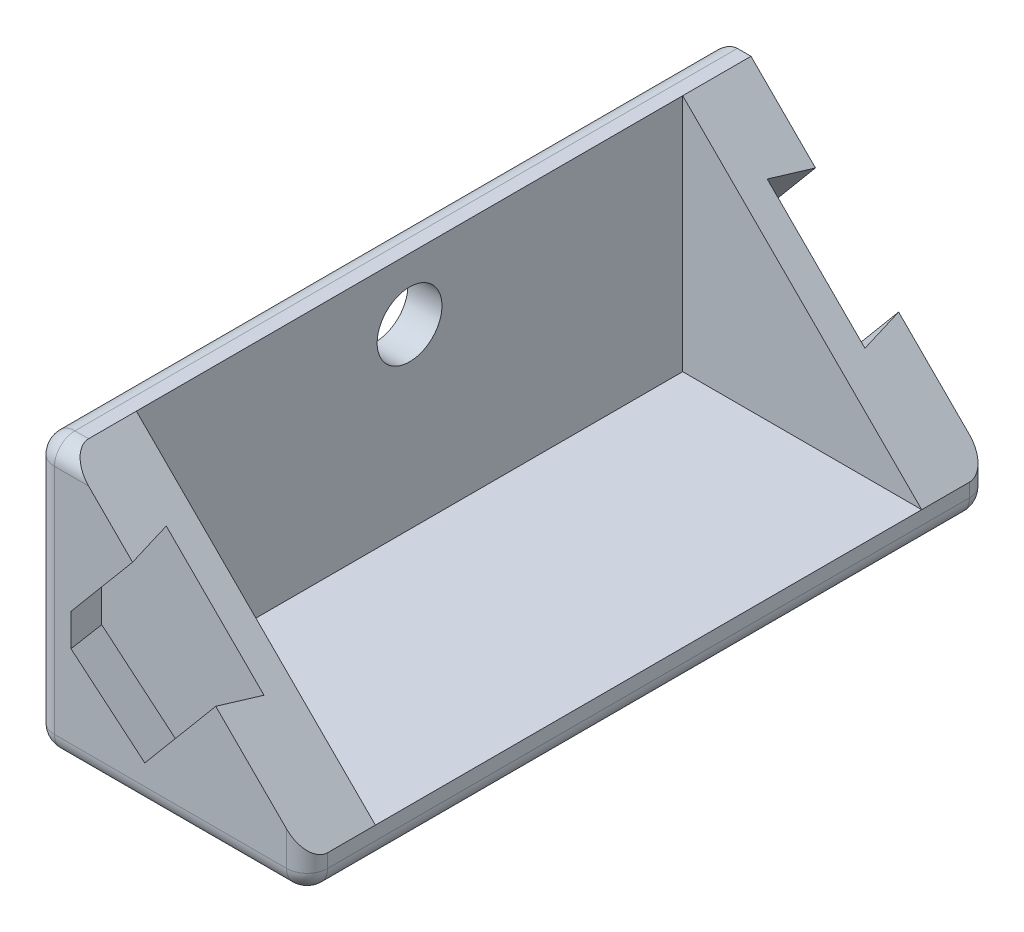
ISO-10303-21;
HEADER;
FILE_DESCRIPTION(('STEP AP214'),'2;1');
FILE_NAME('part.step','',(''),(''),'','','');
FILE_SCHEMA(('AUTOMOTIVE_DESIGN { 1 0 10303 214 1 1 1 1 }'));
ENDSEC;
DATA;
#1=APPLICATION_CONTEXT('core data for automotive mechanical design processes');
#2=APPLICATION_PROTOCOL_DEFINITION('international standard','automotive_design',2000,#1);
#3=PRODUCT_CONTEXT('',#1,'mechanical');
#4=PRODUCT('Part','Part','',(#3));
#5=PRODUCT_RELATED_PRODUCT_CATEGORY('part','',(#4));
#6=PRODUCT_DEFINITION_FORMATION('','',#4);
#7=PRODUCT_DEFINITION_CONTEXT('part definition',#1,'design');
#8=PRODUCT_DEFINITION('design','',#6,#7);
#9=PRODUCT_DEFINITION_SHAPE('','',#8);
#10=(LENGTH_UNIT() NAMED_UNIT(*) SI_UNIT(.MILLI.,.METRE.));
#11=(NAMED_UNIT(*) PLANE_ANGLE_UNIT() SI_UNIT($,.RADIAN.));
#12=(NAMED_UNIT(*) SI_UNIT($,.STERADIAN.) SOLID_ANGLE_UNIT());
#13=UNCERTAINTY_MEASURE_WITH_UNIT(LENGTH_MEASURE(1.E-05),#10,'distance_accuracy_value','');
#14=(GEOMETRIC_REPRESENTATION_CONTEXT(3) GLOBAL_UNCERTAINTY_ASSIGNED_CONTEXT((#13)) GLOBAL_UNIT_ASSIGNED_CONTEXT((#10,
#11,#12)) REPRESENTATION_CONTEXT('',''));
#15=CARTESIAN_POINT('',(0.,0.,0.));
#16=DIRECTION('',(0.,0.,1.));
#17=DIRECTION('',(1.,0.,0.));
#18=AXIS2_PLACEMENT_3D('',#15,#16,#17);
#19=CARTESIAN_POINT('',(0.,0.,-10.));
#20=DIRECTION('',(0.,0.,1.));
#21=DIRECTION('',(1.,0.,0.));
#22=AXIS2_PLACEMENT_3D('',#19,#20,#21);
#23=PLANE('',#22);
#24=DIRECTION('',(0.,-1.,0.));
#25=VECTOR('',#24,1.);
#26=CARTESIAN_POINT('',(-95.,0.,-10.));
#27=LINE('',#26,#25);
#28=CARTESIAN_POINT('',(-95.,-79.1753592594197,-10.));
#29=VERTEX_POINT('',#28);
#30=CARTESIAN_POINT('',(-95.,-114.17535925942,-10.));
#31=VERTEX_POINT('',#30);
#32=EDGE_CURVE('E372',#29,#31,#27,.T.);
#33=ORIENTED_EDGE('',*,*,#32,.F.);
#34=DIRECTION('',(0.707106781186546,-0.707106781186549,0.));
#35=VECTOR('',#34,1.);
#36=CARTESIAN_POINT('',(-87.08767962971,-87.0876796297097,-10.));
#37=LINE('',#36,#35);
#38=CARTESIAN_POINT('',(-60.0000000000002,-114.17535925942,-10.));
#39=VERTEX_POINT('',#38);
#40=EDGE_CURVE('E560',#29,#39,#37,.T.);
#41=ORIENTED_EDGE('',*,*,#40,.T.);
#42=DIRECTION('',(1.,0.,0.));
#43=VECTOR('',#42,1.);
#44=CARTESIAN_POINT('',(0.,-114.17535925942,-10.));
#45=LINE('',#44,#43);
#46=EDGE_CURVE('E232',#31,#39,#45,.T.);
#47=ORIENTED_EDGE('',*,*,#46,.F.);
#48=EDGE_LOOP('',(#33,#41,#47));
#49=FACE_BOUND('',#48,.T.);
#50=ADVANCED_FACE('F55',(#49),#23,.F.);
#51=CARTESIAN_POINT('',(-60.0000000000002,0.,-10.));
#52=DIRECTION('',(-1.,0.,0.));
#53=DIRECTION('',(0.,0.,1.));
#54=AXIS2_PLACEMENT_3D('',#51,#52,#53);
#55=PLANE('',#54);
#56=DIRECTION('',(0.,-1.,0.));
#57=VECTOR('',#56,1.);
#58=CARTESIAN_POINT('',(-60.0000000000002,-119.17535925942,-3.));
#59=LINE('',#58,#57);
#60=CARTESIAN_POINT('',(-60.0000000000002,-114.17535925942,-3.));
#61=VERTEX_POINT('',#60);
#62=CARTESIAN_POINT('',(-60.0000000000002,-116.17535925942,-3.));
#63=VERTEX_POINT('',#62);
#64=EDGE_CURVE('E702',#61,#63,#59,.T.);
#65=ORIENTED_EDGE('',*,*,#64,.T.);
#66=DIRECTION('',(0.,0.,1.));
#67=VECTOR('',#66,1.);
#68=CARTESIAN_POINT('',(-60.0000000000002,-116.17535925942,-97.));
#69=LINE('',#68,#67);
#70=CARTESIAN_POINT('',(-60.0000000000002,-116.17535925942,-97.));
#71=VERTEX_POINT('',#70);
#72=EDGE_CURVE('E654',#63,#71,#69,.F.);
#73=ORIENTED_EDGE('',*,*,#72,.T.);
#74=DIRECTION('',(0.,-1.,0.));
#75=VECTOR('',#74,1.);
#76=CARTESIAN_POINT('',(-60.0000000000002,-114.17535925942,-97.));
#77=LINE('',#76,#75);
#78=CARTESIAN_POINT('',(-60.0000000000002,-114.17535925942,-97.));
#79=VERTEX_POINT('',#78);
#80=EDGE_CURVE('E244',#71,#79,#77,.F.);
#81=ORIENTED_EDGE('',*,*,#80,.T.);
#82=DIRECTION('',(0.,0.,-1.));
#83=VECTOR('',#82,1.);
#84=CARTESIAN_POINT('',(-60.0000000000002,-114.17535925942,-90.));
#85=LINE('',#84,#83);
#86=CARTESIAN_POINT('',(-60.0000000000002,-114.17535925942,-90.));
#87=VERTEX_POINT('',#86);
#88=EDGE_CURVE('E240',#87,#79,#85,.T.);
#89=ORIENTED_EDGE('',*,*,#88,.F.);
#90=DIRECTION('',(0.,0.,1.));
#91=VECTOR('',#90,1.);
#92=CARTESIAN_POINT('',(-60.0000000000002,-114.17535925942,-50.));
#93=LINE('',#92,#91);
#94=EDGE_CURVE('E225',#87,#39,#93,.T.);
#95=ORIENTED_EDGE('',*,*,#94,.T.);
#96=DIRECTION('',(0.,0.,1.));
#97=VECTOR('',#96,1.);
#98=CARTESIAN_POINT('',(-60.0000000000002,-114.17535925942,-10.));
#99=LINE('',#98,#97);
#100=EDGE_CURVE('E564',#39,#61,#99,.T.);
#101=ORIENTED_EDGE('',*,*,#100,.T.);
#102=EDGE_LOOP('',(#65,#73,#81,#89,#95,#101));
#103=FACE_BOUND('',#102,.T.);
#104=ADVANCED_FACE('F242',(#103),#55,.F.);
#105=CARTESIAN_POINT('',(0.,-119.17535925942,-10.));
#106=DIRECTION('',(0.,-1.,0.));
#107=DIRECTION('',(0.,0.,-1.));
#108=AXIS2_PLACEMENT_3D('',#105,#106,#107);
#109=PLANE('',#108);
#110=DIRECTION('',(1.,0.,0.));
#111=VECTOR('',#110,1.);
#112=CARTESIAN_POINT('',(0.,-119.17535925942,-3.));
#113=LINE('',#112,#111);
#114=CARTESIAN_POINT('',(-63.0000000000002,-119.17535925942,-3.));
#115=VERTEX_POINT('',#114);
#116=CARTESIAN_POINT('',(-97.,-119.17535925942,-3.));
#117=VERTEX_POINT('',#116);
#118=EDGE_CURVE('E632',#115,#117,#113,.F.);
#119=ORIENTED_EDGE('',*,*,#118,.T.);
#120=DIRECTION('',(0.,0.,1.));
#121=VECTOR('',#120,1.);
#122=CARTESIAN_POINT('',(-97.,-119.17535925942,-97.));
#123=LINE('',#122,#121);
#124=CARTESIAN_POINT('',(-97.,-119.17535925942,-97.));
#125=VERTEX_POINT('',#124);
#126=EDGE_CURVE('E641',#117,#125,#123,.F.);
#127=ORIENTED_EDGE('',*,*,#126,.T.);
#128=DIRECTION('',(1.,0.,0.));
#129=VECTOR('',#128,1.);
#130=CARTESIAN_POINT('',(0.,-119.17535925942,-97.));
#131=LINE('',#130,#129);
#132=CARTESIAN_POINT('',(-63.0000000000002,-119.17535925942,-97.));
#133=VERTEX_POINT('',#132);
#134=EDGE_CURVE('E638',#125,#133,#131,.T.);
#135=ORIENTED_EDGE('',*,*,#134,.T.);
#136=DIRECTION('',(0.,0.,1.));
#137=VECTOR('',#136,1.);
#138=CARTESIAN_POINT('',(-63.0000000000002,-119.17535925942,-3.));
#139=LINE('',#138,#137);
#140=EDGE_CURVE('E635',#133,#115,#139,.T.);
#141=ORIENTED_EDGE('',*,*,#140,.T.);
#142=EDGE_LOOP('',(#119,#127,#135,#141));
#143=FACE_BOUND('',#142,.T.);
#144=ADVANCED_FACE('F842',(#143),#109,.T.);
#145=CARTESIAN_POINT('',(-100.,0.,-10.));
#146=DIRECTION('',(1.,0.,0.));
#147=DIRECTION('',(0.,0.,-1.));
#148=AXIS2_PLACEMENT_3D('',#145,#146,#147);
#149=PLANE('',#148);
#150=CARTESIAN_POINT('',(-100.,-88.1753592594197,-50.));
#151=DIRECTION('',(-1.,0.,0.));
#152=DIRECTION('',(0.,0.,1.));
#153=AXIS2_PLACEMENT_3D('',#150,#151,#152);
#154=CIRCLE('',#153,4.75);
#155=CARTESIAN_POINT('',(-100.,-88.1753592594197,-45.25));
#156=VERTEX_POINT('',#155);
#157=EDGE_CURVE('E1242',#156,#156,#154,.T.);
#158=ORIENTED_EDGE('',*,*,#157,.F.);
#159=EDGE_LOOP('',(#158));
#160=FACE_BOUND('',#159,.T.);
#161=DIRECTION('',(0.,1.,0.));
#162=VECTOR('',#161,1.);
#163=CARTESIAN_POINT('',(-100.,-119.17535925942,-97.));
#164=LINE('',#163,#162);
#165=CARTESIAN_POINT('',(-100.,-82.1753592594197,-97.));
#166=VERTEX_POINT('',#165);
#167=CARTESIAN_POINT('',(-100.,-116.17535925942,-97.));
#168=VERTEX_POINT('',#167);
#169=EDGE_CURVE('E599',#166,#168,#164,.F.);
#170=ORIENTED_EDGE('',*,*,#169,.T.);
#171=DIRECTION('',(0.,0.,1.));
#172=VECTOR('',#171,1.);
#173=CARTESIAN_POINT('',(-100.,-116.17535925942,-3.));
#174=LINE('',#173,#172);
#175=CARTESIAN_POINT('',(-100.,-116.17535925942,-3.));
#176=VERTEX_POINT('',#175);
#177=EDGE_CURVE('E629',#168,#176,#174,.T.);
#178=ORIENTED_EDGE('',*,*,#177,.T.);
#179=DIRECTION('',(0.,1.,0.));
#180=VECTOR('',#179,1.);
#181=CARTESIAN_POINT('',(-100.,-79.1753592594197,-3.));
#182=LINE('',#181,#180);
#183=CARTESIAN_POINT('',(-100.,-82.1753592594197,-3.));
#184=VERTEX_POINT('',#183);
#185=EDGE_CURVE('E596',#176,#184,#182,.T.);
#186=ORIENTED_EDGE('',*,*,#185,.T.);
#187=DIRECTION('',(0.,0.,1.));
#188=VECTOR('',#187,1.);
#189=CARTESIAN_POINT('',(-100.,-82.1753592594197,-10.));
#190=LINE('',#189,#188);
#191=EDGE_CURVE('E593',#184,#166,#190,.F.);
#192=ORIENTED_EDGE('',*,*,#191,.T.);
#193=EDGE_LOOP('',(#170,#178,#186,#192));
#194=FACE_BOUND('',#193,.T.);
#195=ADVANCED_FACE('F872',(#160,#194),#149,.F.);
#196=CARTESIAN_POINT('',(0.,-79.1753592594197,-10.));
#197=DIRECTION('',(0.,-1.,0.));
#198=DIRECTION('',(0.,0.,-1.));
#199=AXIS2_PLACEMENT_3D('',#196,#197,#198);
#200=PLANE('',#199);
#201=DIRECTION('',(1.,0.,0.));
#202=VECTOR('',#201,1.);
#203=CARTESIAN_POINT('',(0.,-79.1753592594197,-100.));
#204=LINE('',#203,#202);
#205=CARTESIAN_POINT('',(-97.,-79.1753592594197,-100.));
#206=VERTEX_POINT('',#205);
#207=CARTESIAN_POINT('',(-95.,-79.1753592594197,-100.));
#208=VERTEX_POINT('',#207);
#209=EDGE_CURVE('E259',#206,#208,#204,.T.);
#210=ORIENTED_EDGE('',*,*,#209,.F.);
#211=DIRECTION('',(0.,0.,1.));
#212=VECTOR('',#211,1.);
#213=CARTESIAN_POINT('',(-97.,-79.1753592594197,-10.));
#214=LINE('',#213,#212);
#215=CARTESIAN_POINT('',(-97.,-79.1753592594197,-3.));
#216=VERTEX_POINT('',#215);
#217=EDGE_CURVE('E606',#206,#216,#214,.T.);
#218=ORIENTED_EDGE('',*,*,#217,.T.);
#219=DIRECTION('',(1.,0.,0.));
#220=VECTOR('',#219,1.);
#221=CARTESIAN_POINT('',(-95.,-79.1753592594197,-3.));
#222=LINE('',#221,#220);
#223=CARTESIAN_POINT('',(-95.,-79.1753592594197,-3.));
#224=VERTEX_POINT('',#223);
#225=EDGE_CURVE('E603',#216,#224,#222,.T.);
#226=ORIENTED_EDGE('',*,*,#225,.T.);
#227=DIRECTION('',(0.,0.,1.));
#228=VECTOR('',#227,1.);
#229=CARTESIAN_POINT('',(-95.,-79.1753592594197,-10.));
#230=LINE('',#229,#228);
#231=EDGE_CURVE('E570',#29,#224,#230,.T.);
#232=ORIENTED_EDGE('',*,*,#231,.F.);
#233=DIRECTION('',(0.,0.,1.));
#234=VECTOR('',#233,1.);
#235=CARTESIAN_POINT('',(-95.,-79.1753592594197,-50.));
#236=LINE('',#235,#234);
#237=CARTESIAN_POINT('',(-95.,-79.1753592594197,-90.));
#238=VERTEX_POINT('',#237);
#239=EDGE_CURVE('E237',#238,#29,#236,.T.);
#240=ORIENTED_EDGE('',*,*,#239,.F.);
#241=DIRECTION('',(0.,0.,-1.));
#242=VECTOR('',#241,1.);
#243=CARTESIAN_POINT('',(-95.,-79.1753592594197,-90.));
#244=LINE('',#243,#242);
#245=EDGE_CURVE('E248',#238,#208,#244,.T.);
#246=ORIENTED_EDGE('',*,*,#245,.T.);
#247=EDGE_LOOP('',(#210,#218,#226,#232,#240,#246));
#248=FACE_BOUND('',#247,.T.);
#249=ADVANCED_FACE('F721',(#248),#200,.F.);
#250=CARTESIAN_POINT('',(-87.08767962971,-87.0876796297097,-10.));
#251=DIRECTION('',(-0.707106781186549,-0.707106781186546,0.));
#252=DIRECTION('',(0.707106781186546,-0.707106781186549,0.));
#253=AXIS2_PLACEMENT_3D('',#250,#251,#252);
#254=PLANE('',#253);
#255=DIRECTION('',(0.707106781186546,-0.707106781186549,0.));
#256=VECTOR('',#255,1.);
#257=CARTESIAN_POINT('',(-87.08767962971,-87.0876796297097,0.));
#258=LINE('',#257,#256);
#259=CARTESIAN_POINT('',(-73.3783438833581,-100.797015376062,0.));
#260=VERTEX_POINT('',#259);
#261=CARTESIAN_POINT('',(-63.0000000000002,-111.17535925942,0.));
#262=VERTEX_POINT('',#261);
#263=EDGE_CURVE('E557',#260,#262,#258,.T.);
#264=ORIENTED_EDGE('',*,*,#263,.T.);
#265=CARTESIAN_POINT('',(-63.0000000000002,-111.17535925942,-3.));
#266=DIRECTION('',(-0.707106781186549,-0.707106781186546,0.));
#267=DIRECTION('',(-0.707106781186546,0.707106781186549,0.));
#268=AXIS2_PLACEMENT_3D('',#265,#266,#267);
#269=ELLIPSE('',#268,4.24264068711929,3.);
#270=EDGE_CURVE('E590',#262,#61,#269,.F.);
#271=ORIENTED_EDGE('',*,*,#270,.T.);
#272=ORIENTED_EDGE('',*,*,#100,.F.);
#273=ORIENTED_EDGE('',*,*,#40,.F.);
#274=ORIENTED_EDGE('',*,*,#231,.T.);
#275=CARTESIAN_POINT('',(-92.,-82.1753592594197,-3.));
#276=DIRECTION('',(-0.707106781186549,-0.707106781186546,0.));
#277=DIRECTION('',(-0.707106781186546,0.707106781186549,0.));
#278=AXIS2_PLACEMENT_3D('',#275,#276,#277);
#279=ELLIPSE('',#278,4.24264068711928,3.);
#280=CARTESIAN_POINT('',(-92.,-82.1753592594197,0.));
#281=VERTEX_POINT('',#280);
#282=EDGE_CURVE('E587',#224,#281,#279,.F.);
#283=ORIENTED_EDGE('',*,*,#282,.T.);
#284=CARTESIAN_POINT('',(-85.5586459753106,-88.6167132841092,0.));
#285=VERTEX_POINT('',#284);
#286=EDGE_CURVE('E565',#281,#285,#258,.T.);
#287=ORIENTED_EDGE('',*,*,#286,.T.);
#288=DIRECTION('',(-0.172114938779374,0.172114938779375,-0.969924170076169));
#289=VECTOR('',#288,1.);
#290=CARTESIAN_POINT('',(-87.3186211832471,-86.8567380761727,-9.91803794033605));
#291=LINE('',#290,#289);
#292=CARTESIAN_POINT('',(-86.6233576966354,-87.5520015627843,-6.));
#293=VERTEX_POINT('',#292);
#294=EDGE_CURVE('E551',#285,#293,#291,.T.);
#295=ORIENTED_EDGE('',*,*,#294,.T.);
#296=DIRECTION('',(-0.707106781186546,0.707106781186549,0.));
#297=VECTOR('',#296,1.);
#298=CARTESIAN_POINT('',(-87.08767962971,-87.0876796297097,-6.));
#299=LINE('',#298,#297);
#300=CARTESIAN_POINT('',(-72.3136321620333,-101.861727097386,-6.));
#301=VERTEX_POINT('',#300);
#302=EDGE_CURVE('E708',#301,#293,#299,.T.);
#303=ORIENTED_EDGE('',*,*,#302,.F.);
#304=DIRECTION('',(-0.172114938779375,0.172114938779376,0.969924170076168));
#305=VECTOR('',#304,1.);
#306=CARTESIAN_POINT('',(-72.5211979367011,-101.654161322719,-4.83029873433046));
#307=LINE('',#306,#305);
#308=EDGE_CURVE('E547',#301,#260,#307,.T.);
#309=ORIENTED_EDGE('',*,*,#308,.T.);
#310=EDGE_LOOP('',(#264,#271,#272,#273,#274,#283,#287,#295,#303,#309));
#311=FACE_BOUND('',#310,.T.);
#312=ADVANCED_FACE('F728',(#311),#254,.F.);
#313=CARTESIAN_POINT('',(0.,0.,0.));
#314=DIRECTION('',(0.,0.,1.));
#315=DIRECTION('',(1.,0.,0.));
#316=AXIS2_PLACEMENT_3D('',#313,#314,#315);
#317=PLANE('',#316);
#318=DIRECTION('',(0.,1.,0.));
#319=VECTOR('',#318,1.);
#320=CARTESIAN_POINT('',(-97.,-119.17535925942,0.));
#321=LINE('',#320,#319);
#322=CARTESIAN_POINT('',(-97.,-82.1753592594197,0.));
#323=VERTEX_POINT('',#322);
#324=CARTESIAN_POINT('',(-97.,-116.17535925942,0.));
#325=VERTEX_POINT('',#324);
#326=EDGE_CURVE('E581',#323,#325,#321,.F.);
#327=ORIENTED_EDGE('',*,*,#326,.T.);
#328=DIRECTION('',(1.,0.,0.));
#329=VECTOR('',#328,1.);
#330=CARTESIAN_POINT('',(0.,-116.17535925942,0.));
#331=LINE('',#330,#329);
#332=CARTESIAN_POINT('',(-63.0000000000002,-116.17535925942,0.));
#333=VERTEX_POINT('',#332);
#334=EDGE_CURVE('E12',#325,#333,#331,.T.);
#335=ORIENTED_EDGE('',*,*,#334,.T.);
#336=DIRECTION('',(0.,-1.,0.));
#337=VECTOR('',#336,1.);
#338=CARTESIAN_POINT('',(-63.0000000000002,-114.17535925942,0.));
#339=LINE('',#338,#337);
#340=EDGE_CURVE('E584',#333,#262,#339,.F.);
#341=ORIENTED_EDGE('',*,*,#340,.T.);
#342=ORIENTED_EDGE('',*,*,#263,.F.);
#343=DIRECTION('',(0.642787609686544,0.766044443118975,0.));
#344=VECTOR('',#343,1.);
#345=CARTESIAN_POINT('',(6.57266132195838,-5.51511769110851,0.));
#346=LINE('',#345,#344);
#347=CARTESIAN_POINT('',(-83.7645532854487,-113.174817744439,0.));
#348=VERTEX_POINT('',#347);
#349=EDGE_CURVE('E733',#348,#260,#346,.T.);
#350=ORIENTED_EDGE('',*,*,#349,.F.);
#351=DIRECTION('',(-0.766044443118975,0.642787609686543,0.));
#352=VECTOR('',#351,1.);
#353=CARTESIAN_POINT('',(-90.337214607407,-107.65970005333,0.));
#354=LINE('',#353,#352);
#355=CARTESIAN_POINT('',(-94.58,-104.099580395241,0.));
#356=VERTEX_POINT('',#355);
#357=EDGE_CURVE('E815',#348,#356,#354,.T.);
#358=ORIENTED_EDGE('',*,*,#357,.T.);
#359=DIRECTION('',(0.,1.,0.));
#360=VECTOR('',#359,1.);
#361=CARTESIAN_POINT('',(-94.5800000000003,-2.77401127046176E-13,0.));
#362=LINE('',#361,#360);
#363=CARTESIAN_POINT('',(-94.58,-99.3679443530969,0.));
#364=VERTEX_POINT('',#363);
#365=EDGE_CURVE('E525',#356,#364,#362,.T.);
#366=ORIENTED_EDGE('',*,*,#365,.T.);
#367=DIRECTION('',(0.642787609686544,0.766044443118974,0.));
#368=VECTOR('',#367,1.);
#369=CARTESIAN_POINT('',(-6.57266132196076,5.51511769111051,0.));
#370=LINE('',#369,#368);
#371=EDGE_CURVE('E552',#364,#285,#370,.T.);
#372=ORIENTED_EDGE('',*,*,#371,.T.);
#373=ORIENTED_EDGE('',*,*,#286,.F.);
#374=DIRECTION('',(1.,0.,0.));
#375=VECTOR('',#374,1.);
#376=CARTESIAN_POINT('',(-100.,-82.1753592594197,0.));
#377=LINE('',#376,#375);
#378=EDGE_CURVE('E578',#281,#323,#377,.F.);
#379=ORIENTED_EDGE('',*,*,#378,.T.);
#380=EDGE_LOOP('',(#327,#335,#341,#342,#350,#358,#366,#372,#373,#379));
#381=FACE_BOUND('',#380,.T.);
#382=ADVANCED_FACE('F762',(#381),#317,.T.);
#383=CARTESIAN_POINT('',(0.,0.,-6.));
#384=DIRECTION('',(0.,0.,1.));
#385=DIRECTION('',(1.,0.,0.));
#386=AXIS2_PLACEMENT_3D('',#383,#384,#385);
#387=PLANE('',#386);
#388=ORIENTED_EDGE('',*,*,#302,.T.);
#389=DIRECTION('',(0.642787609686527,0.766044443118989,0.));
#390=VECTOR('',#389,1.);
#391=CARTESIAN_POINT('',(-7.72172798664173,6.47929910564214,-6.));
#392=LINE('',#391,#390);
#393=CARTESIAN_POINT('',(-96.08,-98.8219890016976,-6.));
#394=VERTEX_POINT('',#393);
#395=EDGE_CURVE('E479',#394,#293,#392,.T.);
#396=ORIENTED_EDGE('',*,*,#395,.F.);
#397=DIRECTION('',(0.,1.,0.));
#398=VECTOR('',#397,1.);
#399=CARTESIAN_POINT('',(-96.08,0.,-6.));
#400=LINE('',#399,#398);
#401=CARTESIAN_POINT('',(-96.08,-104.799041882474,-6.));
#402=VERTEX_POINT('',#401);
#403=EDGE_CURVE('E473',#402,#394,#400,.T.);
#404=ORIENTED_EDGE('',*,*,#403,.F.);
#405=DIRECTION('',(-0.766044443118869,0.642787609686669,0.));
#406=VECTOR('',#405,1.);
#407=CARTESIAN_POINT('',(-91.3013960219553,-108.808766717995,-6.));
#408=LINE('',#407,#406);
#409=CARTESIAN_POINT('',(-83.5796680353017,-115.288065823649,-6.));
#410=VERTEX_POINT('',#409);
#411=EDGE_CURVE('E742',#410,#402,#408,.T.);
#412=ORIENTED_EDGE('',*,*,#411,.F.);
#413=DIRECTION('',(-0.642787609686543,-0.766044443118975,0.));
#414=VECTOR('',#413,1.);
#415=CARTESIAN_POINT('',(7.72172798663679,-6.47929910563828,-6.));
#416=LINE('',#415,#414);
#417=EDGE_CURVE('E543',#301,#410,#416,.T.);
#418=ORIENTED_EDGE('',*,*,#417,.F.);
#419=EDGE_LOOP('',(#388,#396,#404,#412,#418));
#420=FACE_BOUND('',#419,.T.);
#421=ADVANCED_FACE('F498',(#420),#387,.T.);
#422=CARTESIAN_POINT('',(-6.18603418537483,5.19069900339812,2.01882352941175));
#423=DIRECTION('',(-0.74317227126988,0.623595578723745,0.242535625036333));
#424=DIRECTION('',(-0.642787609686544,-0.766044443118974,0.));
#425=AXIS2_PLACEMENT_3D('',#422,#423,#424);
#426=PLANE('',#425);
#427=ORIENTED_EDGE('',*,*,#371,.F.);
#428=DIRECTION('',(0.241596119887387,-0.0879337963532224,0.966384479549557));
#429=VECTOR('',#428,1.);
#430=CARTESIAN_POINT('',(-96.08,-98.8219890016976,-6.));
#431=LINE('',#430,#429);
#432=EDGE_CURVE('E485',#394,#364,#431,.T.);
#433=ORIENTED_EDGE('',*,*,#432,.F.);
#434=ORIENTED_EDGE('',*,*,#395,.T.);
#435=ORIENTED_EDGE('',*,*,#294,.F.);
#436=EDGE_LOOP('',(#427,#433,#434,#435));
#437=FACE_BOUND('',#436,.T.);
#438=ADVANCED_FACE('F487',(#437),#426,.F.);
#439=CARTESIAN_POINT('',(6.18603418537258,-5.19069900339624,2.01882352941103));
#440=DIRECTION('',(0.74317227126988,-0.623595578723745,0.242535625036334));
#441=DIRECTION('',(0.642787609686544,0.766044443118975,0.));
#442=AXIS2_PLACEMENT_3D('',#439,#440,#441);
#443=PLANE('',#442);
#444=ORIENTED_EDGE('',*,*,#417,.T.);
#445=DIRECTION('',(-0.0290519142489422,0.332064899364209,0.942809041581968));
#446=VECTOR('',#445,1.);
#447=CARTESIAN_POINT('',(-83.5796680353017,-115.288065823649,-6.));
#448=LINE('',#447,#446);
#449=EDGE_CURVE('E516',#410,#348,#448,.T.);
#450=ORIENTED_EDGE('',*,*,#449,.T.);
#451=ORIENTED_EDGE('',*,*,#349,.T.);
#452=ORIENTED_EDGE('',*,*,#308,.F.);
#453=EDGE_LOOP('',(#444,#450,#451,#452));
#454=FACE_BOUND('',#453,.T.);
#455=ADVANCED_FACE('F497',(#454),#443,.F.);
#456=CARTESIAN_POINT('',(-89.0164705882355,-2.61083413690519E-13,22.2541176470589));
#457=DIRECTION('',(-0.970142500145332,0.,0.242535625036333));
#458=DIRECTION('',(0.242535625036333,0.,0.970142500145332));
#459=AXIS2_PLACEMENT_3D('',#456,#457,#458);
#460=PLANE('',#459);
#461=DIRECTION('',(0.240999241199596,0.11237979178092,0.963996964798384));
#462=VECTOR('',#461,1.);
#463=CARTESIAN_POINT('',(-96.08,-104.799041882474,-6.));
#464=LINE('',#463,#462);
#465=EDGE_CURVE('E795',#402,#356,#464,.T.);
#466=ORIENTED_EDGE('',*,*,#465,.F.);
#467=ORIENTED_EDGE('',*,*,#403,.T.);
#468=ORIENTED_EDGE('',*,*,#432,.T.);
#469=ORIENTED_EDGE('',*,*,#365,.F.);
#470=EDGE_LOOP('',(#466,#467,#468,#469));
#471=FACE_BOUND('',#470,.T.);
#472=ADVANCED_FACE('F499',(#471),#460,.F.);
#473=CARTESIAN_POINT('',(-85.0232608069532,-101.32677652076,33.0681781687456));
#474=DIRECTION('',(-0.623595578723678,-0.743172271269802,0.242535625036745));
#475=DIRECTION('',(0.766044443118975,-0.642787609686543,0.));
#476=AXIS2_PLACEMENT_3D('',#473,#474,#475);
#477=PLANE('',#476);
#478=ORIENTED_EDGE('',*,*,#449,.F.);
#479=ORIENTED_EDGE('',*,*,#411,.T.);
#480=ORIENTED_EDGE('',*,*,#465,.T.);
#481=ORIENTED_EDGE('',*,*,#357,.F.);
#482=EDGE_LOOP('',(#478,#479,#480,#481));
#483=FACE_BOUND('',#482,.T.);
#484=ADVANCED_FACE('F502',(#483),#477,.F.);
#485=CARTESIAN_POINT('',(-95.,0.,-50.));
#486=DIRECTION('',(-1.,0.,0.));
#487=DIRECTION('',(0.,0.,1.));
#488=AXIS2_PLACEMENT_3D('',#485,#486,#487);
#489=PLANE('',#488);
#490=CARTESIAN_POINT('',(-95.,-88.1753592594197,-50.));
#491=DIRECTION('',(-1.,0.,0.));
#492=DIRECTION('',(0.,0.,1.));
#493=AXIS2_PLACEMENT_3D('',#490,#491,#492);
#494=CIRCLE('',#493,4.75);
#495=CARTESIAN_POINT('',(-95.,-88.1753592594197,-45.25));
#496=VERTEX_POINT('',#495);
#497=EDGE_CURVE('E59',#496,#496,#494,.T.);
#498=ORIENTED_EDGE('',*,*,#497,.T.);
#499=EDGE_LOOP('',(#498));
#500=FACE_BOUND('',#499,.T.);
#501=ORIENTED_EDGE('',*,*,#32,.T.);
#502=DIRECTION('',(0.,0.,1.));
#503=VECTOR('',#502,1.);
#504=CARTESIAN_POINT('',(-95.,-114.17535925942,-50.));
#505=LINE('',#504,#503);
#506=CARTESIAN_POINT('',(-95.,-114.17535925942,-90.));
#507=VERTEX_POINT('',#506);
#508=EDGE_CURVE('E236',#507,#31,#505,.T.);
#509=ORIENTED_EDGE('',*,*,#508,.F.);
#510=DIRECTION('',(0.,-1.,0.));
#511=VECTOR('',#510,1.);
#512=CARTESIAN_POINT('',(-95.,0.,-90.));
#513=LINE('',#512,#511);
#514=EDGE_CURVE('E262',#238,#507,#513,.T.);
#515=ORIENTED_EDGE('',*,*,#514,.F.);
#516=ORIENTED_EDGE('',*,*,#239,.T.);
#517=EDGE_LOOP('',(#501,#509,#515,#516));
#518=FACE_BOUND('',#517,.T.);
#519=ADVANCED_FACE('F506',(#500,#518),#489,.F.);
#520=CARTESIAN_POINT('',(0.,-114.17535925942,-50.));
#521=DIRECTION('',(0.,-1.,0.));
#522=DIRECTION('',(0.,0.,-1.));
#523=AXIS2_PLACEMENT_3D('',#520,#521,#522);
#524=PLANE('',#523);
#525=ORIENTED_EDGE('',*,*,#46,.T.);
#526=ORIENTED_EDGE('',*,*,#94,.F.);
#527=DIRECTION('',(1.,0.,0.));
#528=VECTOR('',#527,1.);
#529=CARTESIAN_POINT('',(0.,-114.17535925942,-90.));
#530=LINE('',#529,#528);
#531=EDGE_CURVE('E230',#507,#87,#530,.T.);
#532=ORIENTED_EDGE('',*,*,#531,.F.);
#533=ORIENTED_EDGE('',*,*,#508,.T.);
#534=EDGE_LOOP('',(#525,#526,#532,#533));
#535=FACE_BOUND('',#534,.T.);
#536=ADVANCED_FACE('F227',(#535),#524,.F.);
#537=CARTESIAN_POINT('',(0.,0.,-90.));
#538=DIRECTION('',(0.,0.,-1.));
#539=DIRECTION('',(1.,0.,0.));
#540=AXIS2_PLACEMENT_3D('',#537,#538,#539);
#541=PLANE('',#540);
#542=ORIENTED_EDGE('',*,*,#514,.T.);
#543=ORIENTED_EDGE('',*,*,#531,.T.);
#544=DIRECTION('',(0.707106781186546,-0.707106781186549,0.));
#545=VECTOR('',#544,1.);
#546=CARTESIAN_POINT('',(-87.08767962971,-87.0876796297097,-90.));
#547=LINE('',#546,#545);
#548=EDGE_CURVE('E249',#238,#87,#547,.T.);
#549=ORIENTED_EDGE('',*,*,#548,.F.);
#550=EDGE_LOOP('',(#542,#543,#549));
#551=FACE_BOUND('',#550,.T.);
#552=ADVANCED_FACE('F261',(#551),#541,.F.);
#553=CARTESIAN_POINT('',(-87.08767962971,-87.0876796297097,-90.));
#554=DIRECTION('',(-0.707106781186549,-0.707106781186546,0.));
#555=DIRECTION('',(0.707106781186546,-0.707106781186549,0.));
#556=AXIS2_PLACEMENT_3D('',#553,#554,#555);
#557=PLANE('',#556);
#558=ORIENTED_EDGE('',*,*,#88,.T.);
#559=CARTESIAN_POINT('',(-63.0000000000002,-111.17535925942,-97.));
#560=DIRECTION('',(-0.707106781186549,-0.707106781186546,0.));
#561=DIRECTION('',(-0.707106781186546,0.707106781186549,0.));
#562=AXIS2_PLACEMENT_3D('',#559,#560,#561);
#563=ELLIPSE('',#562,4.24264068711929,3.);
#564=CARTESIAN_POINT('',(-63.0000000000002,-111.17535925942,-100.));
#565=VERTEX_POINT('',#564);
#566=EDGE_CURVE('E576',#79,#565,#563,.F.);
#567=ORIENTED_EDGE('',*,*,#566,.T.);
#568=DIRECTION('',(0.707106781186546,-0.707106781186549,0.));
#569=VECTOR('',#568,1.);
#570=CARTESIAN_POINT('',(-87.08767962971,-87.0876796297097,-100.));
#571=LINE('',#570,#569);
#572=CARTESIAN_POINT('',(-73.3783438833581,-100.797015376062,-100.));
#573=VERTEX_POINT('',#572);
#574=EDGE_CURVE('E355',#573,#565,#571,.T.);
#575=ORIENTED_EDGE('',*,*,#574,.F.);
#576=DIRECTION('',(-0.172114938779375,0.172114938779376,-0.969924170076168));
#577=VECTOR('',#576,1.);
#578=CARTESIAN_POINT('',(-72.5211979367011,-101.654161322719,-95.1697012656695));
#579=LINE('',#578,#577);
#580=CARTESIAN_POINT('',(-72.3136321620333,-101.861727097386,-94.));
#581=VERTEX_POINT('',#580);
#582=EDGE_CURVE('E346',#581,#573,#579,.T.);
#583=ORIENTED_EDGE('',*,*,#582,.F.);
#584=DIRECTION('',(-0.707106781186546,0.707106781186549,0.));
#585=VECTOR('',#584,1.);
#586=CARTESIAN_POINT('',(-87.08767962971,-87.0876796297097,-94.));
#587=LINE('',#586,#585);
#588=CARTESIAN_POINT('',(-86.6233576966354,-87.5520015627843,-94.));
#589=VERTEX_POINT('',#588);
#590=EDGE_CURVE('E368',#581,#589,#587,.T.);
#591=ORIENTED_EDGE('',*,*,#590,.T.);
#592=DIRECTION('',(-0.172114938779374,0.172114938779375,0.969924170076169));
#593=VECTOR('',#592,1.);
#594=CARTESIAN_POINT('',(-87.3186211832471,-86.8567380761727,-90.081962059664));
#595=LINE('',#594,#593);
#596=CARTESIAN_POINT('',(-85.5586459753106,-88.6167132841092,-100.));
#597=VERTEX_POINT('',#596);
#598=EDGE_CURVE('E349',#597,#589,#595,.T.);
#599=ORIENTED_EDGE('',*,*,#598,.F.);
#600=EDGE_CURVE('E362',#208,#597,#571,.T.);
#601=ORIENTED_EDGE('',*,*,#600,.F.);
#602=ORIENTED_EDGE('',*,*,#245,.F.);
#603=ORIENTED_EDGE('',*,*,#548,.T.);
#604=EDGE_LOOP('',(#558,#567,#575,#583,#591,#599,#601,#602,#603));
#605=FACE_BOUND('',#604,.T.);
#606=ADVANCED_FACE('F253',(#605),#557,.F.);
#607=CARTESIAN_POINT('',(0.,0.,-100.));
#608=DIRECTION('',(0.,0.,-1.));
#609=DIRECTION('',(1.,0.,0.));
#610=AXIS2_PLACEMENT_3D('',#607,#608,#609);
#611=PLANE('',#610);
#612=DIRECTION('',(0.,-1.,0.));
#613=VECTOR('',#612,1.);
#614=CARTESIAN_POINT('',(-63.0000000000002,-119.17535925942,-100.));
#615=LINE('',#614,#613);
#616=CARTESIAN_POINT('',(-63.0000000000002,-116.17535925942,-100.));
#617=VERTEX_POINT('',#616);
#618=EDGE_CURVE('E698',#565,#617,#615,.T.);
#619=ORIENTED_EDGE('',*,*,#618,.T.);
#620=DIRECTION('',(1.,0.,0.));
#621=VECTOR('',#620,1.);
#622=CARTESIAN_POINT('',(0.,-116.17535925942,-100.));
#623=LINE('',#622,#621);
#624=CARTESIAN_POINT('',(-97.,-116.17535925942,-100.));
#625=VERTEX_POINT('',#624);
#626=EDGE_CURVE('E648',#617,#625,#623,.F.);
#627=ORIENTED_EDGE('',*,*,#626,.T.);
#628=DIRECTION('',(0.,1.,0.));
#629=VECTOR('',#628,1.);
#630=CARTESIAN_POINT('',(-97.,-79.1753592594197,-100.));
#631=LINE('',#630,#629);
#632=EDGE_CURVE('E703',#625,#206,#631,.T.);
#633=ORIENTED_EDGE('',*,*,#632,.T.);
#634=ORIENTED_EDGE('',*,*,#209,.T.);
#635=ORIENTED_EDGE('',*,*,#600,.T.);
#636=DIRECTION('',(0.642787609686544,0.766044443118974,0.));
#637=VECTOR('',#636,1.);
#638=CARTESIAN_POINT('',(-6.57266132196076,5.51511769111051,-100.));
#639=LINE('',#638,#637);
#640=CARTESIAN_POINT('',(-94.58,-99.3679443530969,-100.));
#641=VERTEX_POINT('',#640);
#642=EDGE_CURVE('E350',#641,#597,#639,.T.);
#643=ORIENTED_EDGE('',*,*,#642,.F.);
#644=DIRECTION('',(0.,1.,0.));
#645=VECTOR('',#644,1.);
#646=CARTESIAN_POINT('',(-94.5800000000003,-2.77401127046176E-13,-100.));
#647=LINE('',#646,#645);
#648=CARTESIAN_POINT('',(-94.58,-104.099580395241,-100.));
#649=VERTEX_POINT('',#648);
#650=EDGE_CURVE('E324',#649,#641,#647,.T.);
#651=ORIENTED_EDGE('',*,*,#650,.F.);
#652=DIRECTION('',(-0.766044443118975,0.642787609686543,0.));
#653=VECTOR('',#652,1.);
#654=CARTESIAN_POINT('',(-90.337214607407,-107.65970005333,-100.));
#655=LINE('',#654,#653);
#656=CARTESIAN_POINT('',(-83.7645532854487,-113.174817744439,-100.));
#657=VERTEX_POINT('',#656);
#658=EDGE_CURVE('E449',#657,#649,#655,.T.);
#659=ORIENTED_EDGE('',*,*,#658,.F.);
#660=DIRECTION('',(0.642787609686544,0.766044443118975,0.));
#661=VECTOR('',#660,1.);
#662=CARTESIAN_POINT('',(6.57266132195838,-5.51511769110851,-100.));
#663=LINE('',#662,#661);
#664=EDGE_CURVE('E373',#657,#573,#663,.T.);
#665=ORIENTED_EDGE('',*,*,#664,.T.);
#666=ORIENTED_EDGE('',*,*,#574,.T.);
#667=EDGE_LOOP('',(#619,#627,#633,#634,#635,#643,#651,#659,#665,#666));
#668=FACE_BOUND('',#667,.T.);
#669=ADVANCED_FACE('F398',(#668),#611,.T.);
#670=CARTESIAN_POINT('',(0.,0.,-94.));
#671=DIRECTION('',(0.,0.,-1.));
#672=DIRECTION('',(1.,0.,0.));
#673=AXIS2_PLACEMENT_3D('',#670,#671,#672);
#674=PLANE('',#673);
#675=ORIENTED_EDGE('',*,*,#590,.F.);
#676=DIRECTION('',(-0.642787609686543,-0.766044443118975,0.));
#677=VECTOR('',#676,1.);
#678=CARTESIAN_POINT('',(7.72172798663679,-6.47929910563828,-94.));
#679=LINE('',#678,#677);
#680=CARTESIAN_POINT('',(-83.5796680353017,-115.288065823649,-94.));
#681=VERTEX_POINT('',#680);
#682=EDGE_CURVE('E342',#581,#681,#679,.T.);
#683=ORIENTED_EDGE('',*,*,#682,.T.);
#684=DIRECTION('',(-0.766044443118869,0.642787609686669,0.));
#685=VECTOR('',#684,1.);
#686=CARTESIAN_POINT('',(-91.3013960219553,-108.808766717995,-94.));
#687=LINE('',#686,#685);
#688=CARTESIAN_POINT('',(-96.08,-104.799041882474,-94.));
#689=VERTEX_POINT('',#688);
#690=EDGE_CURVE('E269',#681,#689,#687,.T.);
#691=ORIENTED_EDGE('',*,*,#690,.T.);
#692=DIRECTION('',(0.,1.,0.));
#693=VECTOR('',#692,1.);
#694=CARTESIAN_POINT('',(-96.08,0.,-94.));
#695=LINE('',#694,#693);
#696=CARTESIAN_POINT('',(-96.08,-98.8219890016976,-94.));
#697=VERTEX_POINT('',#696);
#698=EDGE_CURVE('E264',#689,#697,#695,.T.);
#699=ORIENTED_EDGE('',*,*,#698,.T.);
#700=DIRECTION('',(0.642787609686527,0.766044443118989,0.));
#701=VECTOR('',#700,1.);
#702=CARTESIAN_POINT('',(-7.72172798664173,6.47929910564214,-94.));
#703=LINE('',#702,#701);
#704=EDGE_CURVE('E279',#697,#589,#703,.T.);
#705=ORIENTED_EDGE('',*,*,#704,.T.);
#706=EDGE_LOOP('',(#675,#683,#691,#699,#705));
#707=FACE_BOUND('',#706,.T.);
#708=ADVANCED_FACE('F297',(#707),#674,.T.);
#709=CARTESIAN_POINT('',(-6.18603418537483,5.19069900339812,-102.018823529412));
#710=DIRECTION('',(-0.74317227126988,0.623595578723745,-0.242535625036333));
#711=DIRECTION('',(-0.642787609686544,-0.766044443118974,0.));
#712=AXIS2_PLACEMENT_3D('',#709,#710,#711);
#713=PLANE('',#712);
#714=ORIENTED_EDGE('',*,*,#642,.T.);
#715=ORIENTED_EDGE('',*,*,#598,.T.);
#716=ORIENTED_EDGE('',*,*,#704,.F.);
#717=DIRECTION('',(0.241596119887387,-0.0879337963532224,-0.966384479549557));
#718=VECTOR('',#717,1.);
#719=CARTESIAN_POINT('',(-96.08,-98.8219890016976,-94.));
#720=LINE('',#719,#718);
#721=EDGE_CURVE('E284',#697,#641,#720,.T.);
#722=ORIENTED_EDGE('',*,*,#721,.T.);
#723=EDGE_LOOP('',(#714,#715,#716,#722));
#724=FACE_BOUND('',#723,.T.);
#725=ADVANCED_FACE('F286',(#724),#713,.F.);
#726=CARTESIAN_POINT('',(6.18603418537258,-5.19069900339624,-102.018823529411));
#727=DIRECTION('',(0.74317227126988,-0.623595578723745,-0.242535625036334));
#728=DIRECTION('',(0.642787609686544,0.766044443118975,0.));
#729=AXIS2_PLACEMENT_3D('',#726,#727,#728);
#730=PLANE('',#729);
#731=ORIENTED_EDGE('',*,*,#682,.F.);
#732=ORIENTED_EDGE('',*,*,#582,.T.);
#733=ORIENTED_EDGE('',*,*,#664,.F.);
#734=DIRECTION('',(-0.0290519142489422,0.332064899364209,-0.942809041581968));
#735=VECTOR('',#734,1.);
#736=CARTESIAN_POINT('',(-83.5796680353017,-115.288065823649,-94.));
#737=LINE('',#736,#735);
#738=EDGE_CURVE('E316',#681,#657,#737,.T.);
#739=ORIENTED_EDGE('',*,*,#738,.F.);
#740=EDGE_LOOP('',(#731,#732,#733,#739));
#741=FACE_BOUND('',#740,.T.);
#742=ADVANCED_FACE('F296',(#741),#730,.F.);
#743=CARTESIAN_POINT('',(-89.0164705882355,-2.61083413690519E-13,-122.254117647059));
#744=DIRECTION('',(-0.970142500145332,0.,-0.242535625036333));
#745=DIRECTION('',(0.242535625036333,0.,-0.970142500145332));
#746=AXIS2_PLACEMENT_3D('',#743,#744,#745);
#747=PLANE('',#746);
#748=DIRECTION('',(0.240999241199596,0.11237979178092,-0.963996964798384));
#749=VECTOR('',#748,1.);
#750=CARTESIAN_POINT('',(-96.08,-104.799041882474,-94.));
#751=LINE('',#750,#749);
#752=EDGE_CURVE('E427',#689,#649,#751,.T.);
#753=ORIENTED_EDGE('',*,*,#752,.T.);
#754=ORIENTED_EDGE('',*,*,#650,.T.);
#755=ORIENTED_EDGE('',*,*,#721,.F.);
#756=ORIENTED_EDGE('',*,*,#698,.F.);
#757=EDGE_LOOP('',(#753,#754,#755,#756));
#758=FACE_BOUND('',#757,.T.);
#759=ADVANCED_FACE('F298',(#758),#747,.F.);
#760=CARTESIAN_POINT('',(-85.0232608069532,-101.32677652076,-133.068178168746));
#761=DIRECTION('',(-0.623595578723678,-0.743172271269802,-0.242535625036745));
#762=DIRECTION('',(0.766044443118975,-0.642787609686543,0.));
#763=AXIS2_PLACEMENT_3D('',#760,#761,#762);
#764=PLANE('',#763);
#765=ORIENTED_EDGE('',*,*,#738,.T.);
#766=ORIENTED_EDGE('',*,*,#658,.T.);
#767=ORIENTED_EDGE('',*,*,#752,.F.);
#768=ORIENTED_EDGE('',*,*,#690,.F.);
#769=EDGE_LOOP('',(#765,#766,#767,#768));
#770=FACE_BOUND('',#769,.T.);
#771=ADVANCED_FACE('F301',(#770),#764,.F.);
#772=CARTESIAN_POINT('',(-63.0000000000002,0.,-97.));
#773=DIRECTION('',(0.,1.,0.));
#774=DIRECTION('',(0.,0.,1.));
#775=AXIS2_PLACEMENT_3D('',#772,#773,#774);
#776=CYLINDRICAL_SURFACE('',#775,3.);
#777=ORIENTED_EDGE('',*,*,#80,.F.);
#778=CARTESIAN_POINT('',(-63.0000000000002,-116.17535925942,-97.));
#779=DIRECTION('',(0.,1.,0.));
#780=DIRECTION('',(0.,0.,1.));
#781=AXIS2_PLACEMENT_3D('',#778,#779,#780);
#782=CIRCLE('',#781,3.);
#783=EDGE_CURVE('E651',#71,#617,#782,.T.);
#784=ORIENTED_EDGE('',*,*,#783,.T.);
#785=ORIENTED_EDGE('',*,*,#618,.F.);
#786=ORIENTED_EDGE('',*,*,#566,.F.);
#787=EDGE_LOOP('',(#777,#784,#785,#786));
#788=FACE_BOUND('',#787,.T.);
#789=ADVANCED_FACE('F305',(#788),#776,.T.);
#790=CARTESIAN_POINT('',(-63.0000000000002,0.,-3.));
#791=DIRECTION('',(0.,1.,0.));
#792=DIRECTION('',(0.,0.,1.));
#793=AXIS2_PLACEMENT_3D('',#790,#791,#792);
#794=CYLINDRICAL_SURFACE('',#793,3.);
#795=ORIENTED_EDGE('',*,*,#340,.F.);
#796=CARTESIAN_POINT('',(-63.0000000000002,-116.17535925942,-3.));
#797=DIRECTION('',(0.,1.,0.));
#798=DIRECTION('',(0.,0.,1.));
#799=AXIS2_PLACEMENT_3D('',#796,#797,#798);
#800=CIRCLE('',#799,3.);
#801=EDGE_CURVE('E65',#333,#63,#800,.T.);
#802=ORIENTED_EDGE('',*,*,#801,.T.);
#803=ORIENTED_EDGE('',*,*,#64,.F.);
#804=ORIENTED_EDGE('',*,*,#270,.F.);
#805=EDGE_LOOP('',(#795,#802,#803,#804));
#806=FACE_BOUND('',#805,.T.);
#807=ADVANCED_FACE('F832',(#806),#794,.T.);
#808=CARTESIAN_POINT('',(0.,-82.1753592594197,-3.));
#809=DIRECTION('',(-1.,0.,0.));
#810=DIRECTION('',(0.,0.,1.));
#811=AXIS2_PLACEMENT_3D('',#808,#809,#810);
#812=CYLINDRICAL_SURFACE('',#811,3.);
#813=ORIENTED_EDGE('',*,*,#282,.F.);
#814=ORIENTED_EDGE('',*,*,#225,.F.);
#815=CARTESIAN_POINT('',(-97.,-82.1753592594197,-3.));
#816=DIRECTION('',(-1.,0.,0.));
#817=DIRECTION('',(0.,0.,1.));
#818=AXIS2_PLACEMENT_3D('',#815,#816,#817);
#819=CIRCLE('',#818,3.);
#820=EDGE_CURVE('E271',#323,#216,#819,.T.);
#821=ORIENTED_EDGE('',*,*,#820,.F.);
#822=ORIENTED_EDGE('',*,*,#378,.F.);
#823=EDGE_LOOP('',(#813,#814,#821,#822));
#824=FACE_BOUND('',#823,.T.);
#825=ADVANCED_FACE('F884',(#824),#812,.T.);
#826=CARTESIAN_POINT('',(-97.,0.,-3.));
#827=DIRECTION('',(0.,-1.,0.));
#828=DIRECTION('',(0.,0.,-1.));
#829=AXIS2_PLACEMENT_3D('',#826,#827,#828);
#830=CYLINDRICAL_SURFACE('',#829,3.);
#831=ORIENTED_EDGE('',*,*,#185,.F.);
#832=CARTESIAN_POINT('',(-97.,-116.17535925942,-3.));
#833=DIRECTION('',(0.,-1.,0.));
#834=DIRECTION('',(0.,0.,-1.));
#835=AXIS2_PLACEMENT_3D('',#832,#833,#834);
#836=CIRCLE('',#835,3.);
#837=EDGE_CURVE('E609',#176,#325,#836,.F.);
#838=ORIENTED_EDGE('',*,*,#837,.T.);
#839=ORIENTED_EDGE('',*,*,#326,.F.);
#840=CARTESIAN_POINT('',(-97.,-82.1753592594197,-3.));
#841=DIRECTION('',(0.,1.,0.));
#842=DIRECTION('',(0.,0.,1.));
#843=AXIS2_PLACEMENT_3D('',#840,#841,#842);
#844=CIRCLE('',#843,3.);
#845=EDGE_CURVE('E619',#184,#323,#844,.T.);
#846=ORIENTED_EDGE('',*,*,#845,.F.);
#847=EDGE_LOOP('',(#831,#838,#839,#846));
#848=FACE_BOUND('',#847,.T.);
#849=ADVANCED_FACE('F896',(#848),#830,.T.);
#850=CARTESIAN_POINT('',(-97.,-82.1753592594197,-3.));
#851=DIRECTION('',(0.,0.,1.));
#852=DIRECTION('',(1.,0.,0.));
#853=AXIS2_PLACEMENT_3D('',#850,#851,#852);
#854=SPHERICAL_SURFACE('',#853,3.);
#855=ORIENTED_EDGE('',*,*,#845,.T.);
#856=ORIENTED_EDGE('',*,*,#820,.T.);
#857=CARTESIAN_POINT('',(-97.,-82.1753592594197,-3.));
#858=DIRECTION('',(0.,0.,1.));
#859=DIRECTION('',(1.,0.,0.));
#860=AXIS2_PLACEMENT_3D('',#857,#858,#859);
#861=CIRCLE('',#860,3.);
#862=EDGE_CURVE('E614',#184,#216,#861,.F.);
#863=ORIENTED_EDGE('',*,*,#862,.F.);
#864=EDGE_LOOP('',(#855,#856,#863));
#865=FACE_BOUND('',#864,.T.);
#866=ADVANCED_FACE('F892',(#865),#854,.T.);
#867=CARTESIAN_POINT('',(-97.,-82.1753592594197,-10.));
#868=DIRECTION('',(0.,0.,1.));
#869=DIRECTION('',(1.,0.,0.));
#870=AXIS2_PLACEMENT_3D('',#867,#868,#869);
#871=CYLINDRICAL_SURFACE('',#870,3.);
#872=ORIENTED_EDGE('',*,*,#862,.T.);
#873=ORIENTED_EDGE('',*,*,#217,.F.);
#874=CARTESIAN_POINT('',(-97.,-82.1753592594197,-97.));
#875=DIRECTION('',(0.,0.707106781186547,0.707106781186547));
#876=DIRECTION('',(0.,-0.707106781186547,0.707106781186547));
#877=AXIS2_PLACEMENT_3D('',#874,#875,#876);
#878=ELLIPSE('',#877,4.24264068711928,3.);
#879=EDGE_CURVE('E610',#166,#206,#878,.F.);
#880=ORIENTED_EDGE('',*,*,#879,.F.);
#881=ORIENTED_EDGE('',*,*,#191,.F.);
#882=EDGE_LOOP('',(#872,#873,#880,#881));
#883=FACE_BOUND('',#882,.T.);
#884=ADVANCED_FACE('F888',(#883),#871,.T.);
#885=CARTESIAN_POINT('',(-97.,0.,-97.));
#886=DIRECTION('',(0.,-1.,0.));
#887=DIRECTION('',(0.,0.,-1.));
#888=AXIS2_PLACEMENT_3D('',#885,#886,#887);
#889=CYLINDRICAL_SURFACE('',#888,3.);
#890=ORIENTED_EDGE('',*,*,#632,.F.);
#891=CARTESIAN_POINT('',(-97.,-116.17535925942,-97.));
#892=DIRECTION('',(0.,-1.,0.));
#893=DIRECTION('',(0.,0.,-1.));
#894=AXIS2_PLACEMENT_3D('',#891,#892,#893);
#895=CIRCLE('',#894,3.);
#896=EDGE_CURVE('E645',#625,#168,#895,.F.);
#897=ORIENTED_EDGE('',*,*,#896,.T.);
#898=ORIENTED_EDGE('',*,*,#169,.F.);
#899=ORIENTED_EDGE('',*,*,#879,.T.);
#900=EDGE_LOOP('',(#890,#897,#898,#899));
#901=FACE_BOUND('',#900,.T.);
#902=ADVANCED_FACE('F885',(#901),#889,.T.);
#903=CARTESIAN_POINT('',(-63.0000000000002,-116.17535925942,-97.));
#904=DIRECTION('',(0.,-1.,0.));
#905=DIRECTION('',(0.,0.,-1.));
#906=AXIS2_PLACEMENT_3D('',#903,#904,#905);
#907=SPHERICAL_SURFACE('',#906,3.);
#908=CARTESIAN_POINT('',(-63.0000000000002,-116.17535925942,-97.));
#909=DIRECTION('',(-1.,0.,0.));
#910=DIRECTION('',(0.,0.,1.));
#911=AXIS2_PLACEMENT_3D('',#908,#909,#910);
#912=CIRCLE('',#911,3.);
#913=EDGE_CURVE('E681',#617,#133,#912,.T.);
#914=ORIENTED_EDGE('',*,*,#913,.F.);
#915=ORIENTED_EDGE('',*,*,#783,.F.);
#916=CARTESIAN_POINT('',(-63.0000000000002,-116.17535925942,-97.));
#917=DIRECTION('',(0.,0.,1.));
#918=DIRECTION('',(1.,0.,0.));
#919=AXIS2_PLACEMENT_3D('',#916,#917,#918);
#920=CIRCLE('',#919,3.);
#921=EDGE_CURVE('E615',#133,#71,#920,.T.);
#922=ORIENTED_EDGE('',*,*,#921,.F.);
#923=EDGE_LOOP('',(#914,#915,#922));
#924=FACE_BOUND('',#923,.T.);
#925=ADVANCED_FACE('F57',(#924),#907,.T.);
#926=CARTESIAN_POINT('',(-63.0000000000002,-116.17535925942,-10.));
#927=DIRECTION('',(0.,0.,-1.));
#928=DIRECTION('',(-1.,0.,0.));
#929=AXIS2_PLACEMENT_3D('',#926,#927,#928);
#930=CYLINDRICAL_SURFACE('',#929,3.);
#931=ORIENTED_EDGE('',*,*,#921,.T.);
#932=ORIENTED_EDGE('',*,*,#72,.F.);
#933=CARTESIAN_POINT('',(-63.0000000000002,-116.17535925942,-3.));
#934=DIRECTION('',(0.,0.,1.));
#935=DIRECTION('',(1.,0.,0.));
#936=AXIS2_PLACEMENT_3D('',#933,#934,#935);
#937=CIRCLE('',#936,3.);
#938=EDGE_CURVE('E677',#115,#63,#937,.T.);
#939=ORIENTED_EDGE('',*,*,#938,.F.);
#940=ORIENTED_EDGE('',*,*,#140,.F.);
#941=EDGE_LOOP('',(#931,#932,#939,#940));
#942=FACE_BOUND('',#941,.T.);
#943=ADVANCED_FACE('F690',(#942),#930,.T.);
#944=CARTESIAN_POINT('',(0.,-116.17535925942,-97.));
#945=DIRECTION('',(1.,0.,0.));
#946=DIRECTION('',(0.,0.,-1.));
#947=AXIS2_PLACEMENT_3D('',#944,#945,#946);
#948=CYLINDRICAL_SURFACE('',#947,3.);
#949=ORIENTED_EDGE('',*,*,#913,.T.);
#950=ORIENTED_EDGE('',*,*,#134,.F.);
#951=CARTESIAN_POINT('',(-97.,-116.17535925942,-97.));
#952=DIRECTION('',(-1.,0.,0.));
#953=DIRECTION('',(0.,0.,1.));
#954=AXIS2_PLACEMENT_3D('',#951,#952,#953);
#955=CIRCLE('',#954,3.);
#956=EDGE_CURVE('E673',#625,#125,#955,.T.);
#957=ORIENTED_EDGE('',*,*,#956,.F.);
#958=ORIENTED_EDGE('',*,*,#626,.F.);
#959=EDGE_LOOP('',(#949,#950,#957,#958));
#960=FACE_BOUND('',#959,.T.);
#961=ADVANCED_FACE('F854',(#960),#948,.T.);
#962=CARTESIAN_POINT('',(-63.0000000000002,-116.17535925942,-3.));
#963=DIRECTION('',(0.,-1.,0.));
#964=DIRECTION('',(0.,0.,-1.));
#965=AXIS2_PLACEMENT_3D('',#962,#963,#964);
#966=SPHERICAL_SURFACE('',#965,3.);
#967=ORIENTED_EDGE('',*,*,#938,.T.);
#968=ORIENTED_EDGE('',*,*,#801,.F.);
#969=CARTESIAN_POINT('',(-63.0000000000002,-116.17535925942,-3.));
#970=DIRECTION('',(-1.,0.,0.));
#971=DIRECTION('',(0.,0.,1.));
#972=AXIS2_PLACEMENT_3D('',#969,#970,#971);
#973=CIRCLE('',#972,3.);
#974=EDGE_CURVE('E669',#115,#333,#973,.T.);
#975=ORIENTED_EDGE('',*,*,#974,.F.);
#976=EDGE_LOOP('',(#967,#968,#975));
#977=FACE_BOUND('',#976,.T.);
#978=ADVANCED_FACE('F835',(#977),#966,.T.);
#979=CARTESIAN_POINT('',(-97.,-116.17535925942,-97.));
#980=DIRECTION('',(0.,-1.,0.));
#981=DIRECTION('',(0.,0.,-1.));
#982=AXIS2_PLACEMENT_3D('',#979,#980,#981);
#983=SPHERICAL_SURFACE('',#982,3.);
#984=ORIENTED_EDGE('',*,*,#896,.F.);
#985=ORIENTED_EDGE('',*,*,#956,.T.);
#986=CARTESIAN_POINT('',(-97.,-116.17535925942,-97.));
#987=DIRECTION('',(0.,0.,1.));
#988=DIRECTION('',(1.,0.,0.));
#989=AXIS2_PLACEMENT_3D('',#986,#987,#988);
#990=CIRCLE('',#989,3.);
#991=EDGE_CURVE('E666',#168,#125,#990,.T.);
#992=ORIENTED_EDGE('',*,*,#991,.F.);
#993=EDGE_LOOP('',(#984,#985,#992));
#994=FACE_BOUND('',#993,.T.);
#995=ADVANCED_FACE('F852',(#994),#983,.T.);
#996=CARTESIAN_POINT('',(0.,-116.17535925942,-3.));
#997=DIRECTION('',(1.,0.,0.));
#998=DIRECTION('',(0.,0.,-1.));
#999=AXIS2_PLACEMENT_3D('',#996,#997,#998);
#1000=CYLINDRICAL_SURFACE('',#999,3.);
#1001=ORIENTED_EDGE('',*,*,#974,.T.);
#1002=ORIENTED_EDGE('',*,*,#334,.F.);
#1003=CARTESIAN_POINT('',(-97.,-116.17535925942,-3.));
#1004=DIRECTION('',(-1.,0.,0.));
#1005=DIRECTION('',(0.,0.,1.));
#1006=AXIS2_PLACEMENT_3D('',#1003,#1004,#1005);
#1007=CIRCLE('',#1006,3.);
#1008=EDGE_CURVE('E663',#117,#325,#1007,.T.);
#1009=ORIENTED_EDGE('',*,*,#1008,.F.);
#1010=ORIENTED_EDGE('',*,*,#118,.F.);
#1011=EDGE_LOOP('',(#1001,#1002,#1009,#1010));
#1012=FACE_BOUND('',#1011,.T.);
#1013=ADVANCED_FACE('F838',(#1012),#1000,.T.);
#1014=CARTESIAN_POINT('',(-97.,-116.17535925942,-10.));
#1015=DIRECTION('',(0.,0.,-1.));
#1016=DIRECTION('',(-1.,0.,0.));
#1017=AXIS2_PLACEMENT_3D('',#1014,#1015,#1016);
#1018=CYLINDRICAL_SURFACE('',#1017,3.);
#1019=ORIENTED_EDGE('',*,*,#991,.T.);
#1020=ORIENTED_EDGE('',*,*,#126,.F.);
#1021=CARTESIAN_POINT('',(-97.,-116.17535925942,-3.));
#1022=DIRECTION('',(0.,0.,1.));
#1023=DIRECTION('',(1.,0.,0.));
#1024=AXIS2_PLACEMENT_3D('',#1021,#1022,#1023);
#1025=CIRCLE('',#1024,3.);
#1026=EDGE_CURVE('E659',#176,#117,#1025,.T.);
#1027=ORIENTED_EDGE('',*,*,#1026,.F.);
#1028=ORIENTED_EDGE('',*,*,#177,.F.);
#1029=EDGE_LOOP('',(#1019,#1020,#1027,#1028));
#1030=FACE_BOUND('',#1029,.T.);
#1031=ADVANCED_FACE('F845',(#1030),#1018,.T.);
#1032=CARTESIAN_POINT('',(-97.,-116.17535925942,-3.));
#1033=DIRECTION('',(0.,-1.,0.));
#1034=DIRECTION('',(0.,0.,-1.));
#1035=AXIS2_PLACEMENT_3D('',#1032,#1033,#1034);
#1036=SPHERICAL_SURFACE('',#1035,3.);
#1037=ORIENTED_EDGE('',*,*,#1008,.T.);
#1038=ORIENTED_EDGE('',*,*,#837,.F.);
#1039=ORIENTED_EDGE('',*,*,#1026,.T.);
#1040=EDGE_LOOP('',(#1037,#1038,#1039));
#1041=FACE_BOUND('',#1040,.T.);
#1042=ADVANCED_FACE('F904',(#1041),#1036,.T.);
#1043=CARTESIAN_POINT('',(-90.,-88.1753592594197,-50.));
#1044=DIRECTION('',(-1.,0.,0.));
#1045=DIRECTION('',(0.,0.,1.));
#1046=AXIS2_PLACEMENT_3D('',#1043,#1044,#1045);
#1047=CYLINDRICAL_SURFACE('',#1046,4.75);
#1048=ORIENTED_EDGE('',*,*,#157,.T.);
#1049=EDGE_LOOP('',(#1048));
#1050=FACE_BOUND('',#1049,.T.);
#1051=ORIENTED_EDGE('',*,*,#497,.F.);
#1052=EDGE_LOOP('',(#1051));
#1053=FACE_BOUND('',#1052,.T.);
#1054=ADVANCED_FACE('F400',(#1050,#1053),#1047,.F.);
#1055=CLOSED_SHELL('',(#50,#104,#144,#195,#249,#312,#382,#421,#438,#455,#472,#484,#519,#536,
#552,#606,#669,#708,#725,#742,#759,#771,#789,#807,#825,#849,#866,#884,#902,#925,#943,#961,#978,
#995,#1013,#1031,#1042,#1054));
#1056=MANIFOLD_SOLID_BREP('B2',#1055);
#1057=ADVANCED_BREP_SHAPE_REPRESENTATION('',(#18,#1056),#14);
#1058=SHAPE_DEFINITION_REPRESENTATION(#9,#1057);
ENDSEC;
END-ISO-10303-21;
